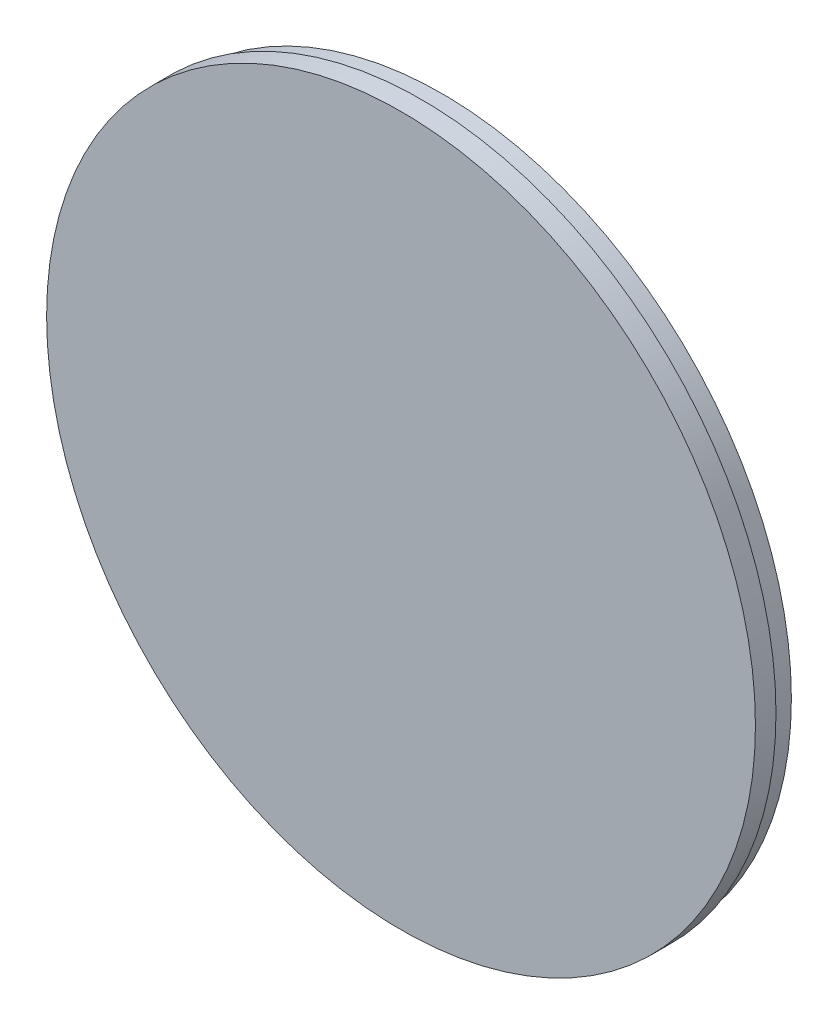
ISO-10303-21;
HEADER;
FILE_DESCRIPTION(('STEP AP214'),'2;1');
FILE_NAME('part.step','',(''),(''),'','','');
FILE_SCHEMA(('AUTOMOTIVE_DESIGN { 1 0 10303 214 1 1 1 1 }'));
ENDSEC;
DATA;
#1=APPLICATION_CONTEXT('core data for automotive mechanical design processes');
#2=APPLICATION_PROTOCOL_DEFINITION('international standard','automotive_design',2000,#1);
#3=PRODUCT_CONTEXT('',#1,'mechanical');
#4=PRODUCT('Part','Part','',(#3));
#5=PRODUCT_RELATED_PRODUCT_CATEGORY('part','',(#4));
#6=PRODUCT_DEFINITION_FORMATION('','',#4);
#7=PRODUCT_DEFINITION_CONTEXT('part definition',#1,'design');
#8=PRODUCT_DEFINITION('design','',#6,#7);
#9=PRODUCT_DEFINITION_SHAPE('','',#8);
#10=(LENGTH_UNIT() NAMED_UNIT(*) SI_UNIT(.MILLI.,.METRE.));
#11=(NAMED_UNIT(*) PLANE_ANGLE_UNIT() SI_UNIT($,.RADIAN.));
#12=(NAMED_UNIT(*) SI_UNIT($,.STERADIAN.) SOLID_ANGLE_UNIT());
#13=UNCERTAINTY_MEASURE_WITH_UNIT(LENGTH_MEASURE(1.E-05),#10,'distance_accuracy_value','');
#14=(GEOMETRIC_REPRESENTATION_CONTEXT(3) GLOBAL_UNCERTAINTY_ASSIGNED_CONTEXT((#13)) GLOBAL_UNIT_ASSIGNED_CONTEXT((#10,
#11,#12)) REPRESENTATION_CONTEXT('',''));
#15=CARTESIAN_POINT('',(0.,0.,0.));
#16=DIRECTION('',(0.,0.,1.));
#17=DIRECTION('',(1.,0.,0.));
#18=AXIS2_PLACEMENT_3D('',#15,#16,#17);
#19=CARTESIAN_POINT('',(0.,0.,1.));
#20=DIRECTION('',(0.,0.,-1.));
#21=DIRECTION('',(-1.,0.,0.));
#22=AXIS2_PLACEMENT_3D('',#19,#20,#21);
#23=CYLINDRICAL_SURFACE('',#22,17.);
#24=CARTESIAN_POINT('',(0.,0.,1.));
#25=DIRECTION('',(0.,0.,1.));
#26=DIRECTION('',(1.,0.,0.));
#27=AXIS2_PLACEMENT_3D('',#24,#25,#26);
#28=CIRCLE('',#27,17.);
#29=CARTESIAN_POINT('',(17.,0.,1.));
#30=VERTEX_POINT('',#29);
#31=EDGE_CURVE('E10',#30,#30,#28,.T.);
#32=ORIENTED_EDGE('',*,*,#31,.F.);
#33=EDGE_LOOP('',(#32));
#34=FACE_BOUND('',#33,.T.);
#35=CARTESIAN_POINT('',(0.,0.,0.));
#36=DIRECTION('',(0.,0.,1.));
#37=DIRECTION('',(1.,0.,0.));
#38=AXIS2_PLACEMENT_3D('',#35,#36,#37);
#39=CIRCLE('',#38,17.);
#40=CARTESIAN_POINT('',(17.,0.,0.));
#41=VERTEX_POINT('',#40);
#42=EDGE_CURVE('E34',#41,#41,#39,.T.);
#43=ORIENTED_EDGE('',*,*,#42,.T.);
#44=EDGE_LOOP('',(#43));
#45=FACE_BOUND('',#44,.T.);
#46=ADVANCED_FACE('F31',(#34,#45),#23,.T.);
#47=CARTESIAN_POINT('',(0.,0.,0.));
#48=DIRECTION('',(0.,0.,1.));
#49=DIRECTION('',(1.,0.,0.));
#50=AXIS2_PLACEMENT_3D('',#47,#48,#49);
#51=PLANE('',#50);
#52=ORIENTED_EDGE('',*,*,#42,.F.);
#53=EDGE_LOOP('',(#52));
#54=FACE_BOUND('',#53,.T.);
#55=ADVANCED_FACE('F54',(#54),#51,.F.);
#56=CARTESIAN_POINT('',(0.,0.,2.));
#57=DIRECTION('',(0.,0.,-1.));
#58=DIRECTION('',(-1.,0.,0.));
#59=AXIS2_PLACEMENT_3D('',#56,#57,#58);
#60=CYLINDRICAL_SURFACE('',#59,17.25);
#61=CARTESIAN_POINT('',(0.,0.,2.));
#62=DIRECTION('',(0.,0.,1.));
#63=DIRECTION('',(1.,0.,0.));
#64=AXIS2_PLACEMENT_3D('',#61,#62,#63);
#65=CIRCLE('',#64,17.25);
#66=CARTESIAN_POINT('',(17.25,0.,2.));
#67=VERTEX_POINT('',#66);
#68=EDGE_CURVE('E41',#67,#67,#65,.T.);
#69=ORIENTED_EDGE('',*,*,#68,.F.);
#70=EDGE_LOOP('',(#69));
#71=FACE_BOUND('',#70,.T.);
#72=CARTESIAN_POINT('',(0.,0.,1.));
#73=DIRECTION('',(0.,0.,1.));
#74=DIRECTION('',(1.,0.,0.));
#75=AXIS2_PLACEMENT_3D('',#72,#73,#74);
#76=CIRCLE('',#75,17.25);
#77=CARTESIAN_POINT('',(17.25,0.,1.));
#78=VERTEX_POINT('',#77);
#79=EDGE_CURVE('E43',#78,#78,#76,.T.);
#80=ORIENTED_EDGE('',*,*,#79,.T.);
#81=EDGE_LOOP('',(#80));
#82=FACE_BOUND('',#81,.T.);
#83=ADVANCED_FACE('F51',(#71,#82),#60,.T.);
#84=CARTESIAN_POINT('',(0.,0.,2.));
#85=DIRECTION('',(0.,0.,1.));
#86=DIRECTION('',(1.,0.,0.));
#87=AXIS2_PLACEMENT_3D('',#84,#85,#86);
#88=PLANE('',#87);
#89=ORIENTED_EDGE('',*,*,#68,.T.);
#90=EDGE_LOOP('',(#89));
#91=FACE_BOUND('',#90,.T.);
#92=ADVANCED_FACE('F49',(#91),#88,.T.);
#93=CARTESIAN_POINT('',(0.,0.,1.));
#94=DIRECTION('',(0.,0.,1.));
#95=DIRECTION('',(1.,0.,0.));
#96=AXIS2_PLACEMENT_3D('',#93,#94,#95);
#97=PLANE('',#96);
#98=ORIENTED_EDGE('',*,*,#31,.T.);
#99=EDGE_LOOP('',(#98));
#100=FACE_BOUND('',#99,.T.);
#101=ORIENTED_EDGE('',*,*,#79,.F.);
#102=EDGE_LOOP('',(#101));
#103=FACE_BOUND('',#102,.T.);
#104=ADVANCED_FACE('F58',(#100,#103),#97,.F.);
#105=CLOSED_SHELL('',(#46,#55,#83,#92,#104));
#106=MANIFOLD_SOLID_BREP('B2',#105);
#107=ADVANCED_BREP_SHAPE_REPRESENTATION('',(#18,#106),#14);
#108=SHAPE_DEFINITION_REPRESENTATION(#9,#107);
ENDSEC;
END-ISO-10303-21;
